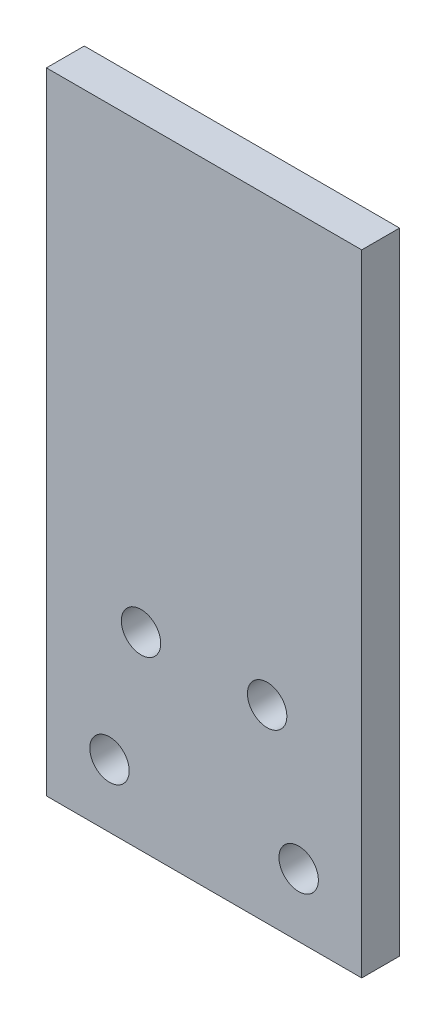
ISO-10303-21;
HEADER;
FILE_DESCRIPTION(('STEP AP214'),'2;1');
FILE_NAME('part.step','',(''),(''),'','','');
FILE_SCHEMA(('AUTOMOTIVE_DESIGN { 1 0 10303 214 1 1 1 1 }'));
ENDSEC;
DATA;
#1=APPLICATION_CONTEXT('core data for automotive mechanical design processes');
#2=APPLICATION_PROTOCOL_DEFINITION('international standard','automotive_design',2000,#1);
#3=PRODUCT_CONTEXT('',#1,'mechanical');
#4=PRODUCT('Part','Part','',(#3));
#5=PRODUCT_RELATED_PRODUCT_CATEGORY('part','',(#4));
#6=PRODUCT_DEFINITION_FORMATION('','',#4);
#7=PRODUCT_DEFINITION_CONTEXT('part definition',#1,'design');
#8=PRODUCT_DEFINITION('design','',#6,#7);
#9=PRODUCT_DEFINITION_SHAPE('','',#8);
#10=(LENGTH_UNIT() NAMED_UNIT(*) SI_UNIT(.MILLI.,.METRE.));
#11=(NAMED_UNIT(*) PLANE_ANGLE_UNIT() SI_UNIT($,.RADIAN.));
#12=(NAMED_UNIT(*) SI_UNIT($,.STERADIAN.) SOLID_ANGLE_UNIT());
#13=UNCERTAINTY_MEASURE_WITH_UNIT(LENGTH_MEASURE(1.E-05),#10,'distance_accuracy_value','');
#14=(GEOMETRIC_REPRESENTATION_CONTEXT(3) GLOBAL_UNCERTAINTY_ASSIGNED_CONTEXT((#13)) GLOBAL_UNIT_ASSIGNED_CONTEXT((#10,
#11,#12)) REPRESENTATION_CONTEXT('',''));
#15=CARTESIAN_POINT('',(0.,0.,0.));
#16=DIRECTION('',(0.,0.,1.));
#17=DIRECTION('',(1.,0.,0.));
#18=AXIS2_PLACEMENT_3D('',#15,#16,#17);
#19=CARTESIAN_POINT('',(-31.75,-63.5,3.81));
#20=DIRECTION('',(0.,1.,0.));
#21=DIRECTION('',(0.,0.,1.));
#22=AXIS2_PLACEMENT_3D('',#19,#20,#21);
#23=PLANE('',#22);
#24=DIRECTION('',(1.,0.,0.));
#25=VECTOR('',#24,1.);
#26=CARTESIAN_POINT('',(-31.75,-63.5,-3.81));
#27=LINE('',#26,#25);
#28=CARTESIAN_POINT('',(-31.75,-63.5,-3.81));
#29=VERTEX_POINT('',#28);
#30=CARTESIAN_POINT('',(31.75,-63.5,-3.81));
#31=VERTEX_POINT('',#30);
#32=EDGE_CURVE('E99',#29,#31,#27,.T.);
#33=ORIENTED_EDGE('',*,*,#32,.T.);
#34=DIRECTION('',(0.,0.,-1.));
#35=VECTOR('',#34,1.);
#36=CARTESIAN_POINT('',(31.75,-63.5,3.81));
#37=LINE('',#36,#35);
#38=CARTESIAN_POINT('',(31.75,-63.5,3.81));
#39=VERTEX_POINT('',#38);
#40=EDGE_CURVE('E11',#39,#31,#37,.T.);
#41=ORIENTED_EDGE('',*,*,#40,.F.);
#42=DIRECTION('',(1.,0.,0.));
#43=VECTOR('',#42,1.);
#44=CARTESIAN_POINT('',(-31.75,-63.5,3.81));
#45=LINE('',#44,#43);
#46=CARTESIAN_POINT('',(-31.75,-63.5,3.81));
#47=VERTEX_POINT('',#46);
#48=EDGE_CURVE('E85',#47,#39,#45,.T.);
#49=ORIENTED_EDGE('',*,*,#48,.F.);
#50=DIRECTION('',(0.,0.,-1.));
#51=VECTOR('',#50,1.);
#52=CARTESIAN_POINT('',(-31.75,-63.5,3.81));
#53=LINE('',#52,#51);
#54=EDGE_CURVE('E52',#47,#29,#53,.T.);
#55=ORIENTED_EDGE('',*,*,#54,.T.);
#56=EDGE_LOOP('',(#33,#41,#49,#55));
#57=FACE_BOUND('',#56,.T.);
#58=ADVANCED_FACE('F36',(#57),#23,.F.);
#59=CARTESIAN_POINT('',(31.75,-63.5,3.81));
#60=DIRECTION('',(-1.,0.,0.));
#61=DIRECTION('',(0.,0.,1.));
#62=AXIS2_PLACEMENT_3D('',#59,#60,#61);
#63=PLANE('',#62);
#64=DIRECTION('',(0.,1.,0.));
#65=VECTOR('',#64,1.);
#66=CARTESIAN_POINT('',(31.75,-63.5,-3.81));
#67=LINE('',#66,#65);
#68=CARTESIAN_POINT('',(31.75,63.5,-3.81));
#69=VERTEX_POINT('',#68);
#70=EDGE_CURVE('E90',#31,#69,#67,.T.);
#71=ORIENTED_EDGE('',*,*,#70,.T.);
#72=DIRECTION('',(0.,0.,-1.));
#73=VECTOR('',#72,1.);
#74=CARTESIAN_POINT('',(31.75,63.5,3.81));
#75=LINE('',#74,#73);
#76=CARTESIAN_POINT('',(31.75,63.5,3.81));
#77=VERTEX_POINT('',#76);
#78=EDGE_CURVE('E44',#77,#69,#75,.T.);
#79=ORIENTED_EDGE('',*,*,#78,.F.);
#80=DIRECTION('',(0.,1.,0.));
#81=VECTOR('',#80,1.);
#82=CARTESIAN_POINT('',(31.75,-63.5,3.81));
#83=LINE('',#82,#81);
#84=EDGE_CURVE('E77',#39,#77,#83,.T.);
#85=ORIENTED_EDGE('',*,*,#84,.F.);
#86=ORIENTED_EDGE('',*,*,#40,.T.);
#87=EDGE_LOOP('',(#71,#79,#85,#86));
#88=FACE_BOUND('',#87,.T.);
#89=ADVANCED_FACE('F89',(#88),#63,.F.);
#90=CARTESIAN_POINT('',(-31.75,63.5,3.81));
#91=DIRECTION('',(0.,1.,0.));
#92=DIRECTION('',(0.,0.,1.));
#93=AXIS2_PLACEMENT_3D('',#90,#91,#92);
#94=PLANE('',#93);
#95=DIRECTION('',(1.,0.,0.));
#96=VECTOR('',#95,1.);
#97=CARTESIAN_POINT('',(-31.75,63.5,-3.81));
#98=LINE('',#97,#96);
#99=CARTESIAN_POINT('',(-31.75,63.5,-3.81));
#100=VERTEX_POINT('',#99);
#101=EDGE_CURVE('E103',#100,#69,#98,.T.);
#102=ORIENTED_EDGE('',*,*,#101,.F.);
#103=DIRECTION('',(0.,0.,-1.));
#104=VECTOR('',#103,1.);
#105=CARTESIAN_POINT('',(-31.75,63.5,3.81));
#106=LINE('',#105,#104);
#107=CARTESIAN_POINT('',(-31.75,63.5,3.81));
#108=VERTEX_POINT('',#107);
#109=EDGE_CURVE('E66',#108,#100,#106,.T.);
#110=ORIENTED_EDGE('',*,*,#109,.F.);
#111=DIRECTION('',(1.,0.,0.));
#112=VECTOR('',#111,1.);
#113=CARTESIAN_POINT('',(-31.75,63.5,3.81));
#114=LINE('',#113,#112);
#115=EDGE_CURVE('E84',#108,#77,#114,.T.);
#116=ORIENTED_EDGE('',*,*,#115,.T.);
#117=ORIENTED_EDGE('',*,*,#78,.T.);
#118=EDGE_LOOP('',(#102,#110,#116,#117));
#119=FACE_BOUND('',#118,.T.);
#120=ADVANCED_FACE('F93',(#119),#94,.T.);
#121=CARTESIAN_POINT('',(-31.75,-63.5,3.81));
#122=DIRECTION('',(-1.,0.,0.));
#123=DIRECTION('',(0.,0.,1.));
#124=AXIS2_PLACEMENT_3D('',#121,#122,#123);
#125=PLANE('',#124);
#126=DIRECTION('',(0.,1.,0.));
#127=VECTOR('',#126,1.);
#128=CARTESIAN_POINT('',(-31.75,-63.5,-3.81));
#129=LINE('',#128,#127);
#130=EDGE_CURVE('E105',#29,#100,#129,.T.);
#131=ORIENTED_EDGE('',*,*,#130,.F.);
#132=ORIENTED_EDGE('',*,*,#54,.F.);
#133=DIRECTION('',(0.,1.,0.));
#134=VECTOR('',#133,1.);
#135=CARTESIAN_POINT('',(-31.75,-63.5,3.81));
#136=LINE('',#135,#134);
#137=EDGE_CURVE('E94',#47,#108,#136,.T.);
#138=ORIENTED_EDGE('',*,*,#137,.T.);
#139=ORIENTED_EDGE('',*,*,#109,.T.);
#140=EDGE_LOOP('',(#131,#132,#138,#139));
#141=FACE_BOUND('',#140,.T.);
#142=ADVANCED_FACE('F140',(#141),#125,.T.);
#143=CARTESIAN_POINT('',(0.,0.,3.81));
#144=DIRECTION('',(0.,0.,1.));
#145=DIRECTION('',(1.,0.,0.));
#146=AXIS2_PLACEMENT_3D('',#143,#144,#145);
#147=PLANE('',#146);
#148=CARTESIAN_POINT('',(-12.7,-25.4,3.81));
#149=DIRECTION('',(0.,0.,1.));
#150=DIRECTION('',(1.,0.,0.));
#151=AXIS2_PLACEMENT_3D('',#148,#149,#150);
#152=CIRCLE('',#151,3.96874999999999);
#153=CARTESIAN_POINT('',(-8.73125000000001,-25.4,3.81));
#154=VERTEX_POINT('',#153);
#155=EDGE_CURVE('E131',#154,#154,#152,.T.);
#156=ORIENTED_EDGE('',*,*,#155,.F.);
#157=EDGE_LOOP('',(#156));
#158=FACE_BOUND('',#157,.T.);
#159=CARTESIAN_POINT('',(12.7,-25.4,3.81));
#160=DIRECTION('',(0.,0.,1.));
#161=DIRECTION('',(1.,0.,0.));
#162=AXIS2_PLACEMENT_3D('',#159,#160,#161);
#163=CIRCLE('',#162,3.96874999999999);
#164=CARTESIAN_POINT('',(16.66875,-25.4,3.81));
#165=VERTEX_POINT('',#164);
#166=EDGE_CURVE('E125',#165,#165,#163,.T.);
#167=ORIENTED_EDGE('',*,*,#166,.F.);
#168=EDGE_LOOP('',(#167));
#169=FACE_BOUND('',#168,.T.);
#170=CARTESIAN_POINT('',(-19.05,-50.8,3.81));
#171=DIRECTION('',(0.,0.,1.));
#172=DIRECTION('',(1.,0.,0.));
#173=AXIS2_PLACEMENT_3D('',#170,#171,#172);
#174=CIRCLE('',#173,3.96874999999999);
#175=CARTESIAN_POINT('',(-15.08125,-50.8,3.81));
#176=VERTEX_POINT('',#175);
#177=EDGE_CURVE('E119',#176,#176,#174,.T.);
#178=ORIENTED_EDGE('',*,*,#177,.F.);
#179=EDGE_LOOP('',(#178));
#180=FACE_BOUND('',#179,.T.);
#181=CARTESIAN_POINT('',(19.05,-50.8,3.81));
#182=DIRECTION('',(0.,0.,1.));
#183=DIRECTION('',(1.,0.,0.));
#184=AXIS2_PLACEMENT_3D('',#181,#182,#183);
#185=CIRCLE('',#184,3.96874999999999);
#186=CARTESIAN_POINT('',(23.01875,-50.8,3.81));
#187=VERTEX_POINT('',#186);
#188=EDGE_CURVE('E113',#187,#187,#185,.T.);
#189=ORIENTED_EDGE('',*,*,#188,.F.);
#190=EDGE_LOOP('',(#189));
#191=FACE_BOUND('',#190,.T.);
#192=ORIENTED_EDGE('',*,*,#48,.T.);
#193=ORIENTED_EDGE('',*,*,#84,.T.);
#194=ORIENTED_EDGE('',*,*,#115,.F.);
#195=ORIENTED_EDGE('',*,*,#137,.F.);
#196=EDGE_LOOP('',(#192,#193,#194,#195));
#197=FACE_BOUND('',#196,.T.);
#198=ADVANCED_FACE('F81',(#158,#169,#180,#191,#197),#147,.T.);
#199=CARTESIAN_POINT('',(0.,0.,-3.81));
#200=DIRECTION('',(0.,0.,1.));
#201=DIRECTION('',(1.,0.,0.));
#202=AXIS2_PLACEMENT_3D('',#199,#200,#201);
#203=PLANE('',#202);
#204=CARTESIAN_POINT('',(-12.7,-25.4,-3.81));
#205=DIRECTION('',(0.,0.,1.));
#206=DIRECTION('',(1.,0.,0.));
#207=AXIS2_PLACEMENT_3D('',#204,#205,#206);
#208=CIRCLE('',#207,3.96875);
#209=CARTESIAN_POINT('',(-8.73125,-25.4,-3.81));
#210=VERTEX_POINT('',#209);
#211=EDGE_CURVE('E128',#210,#210,#208,.T.);
#212=ORIENTED_EDGE('',*,*,#211,.T.);
#213=EDGE_LOOP('',(#212));
#214=FACE_BOUND('',#213,.T.);
#215=CARTESIAN_POINT('',(12.7,-25.4,-3.81));
#216=DIRECTION('',(0.,0.,1.));
#217=DIRECTION('',(1.,0.,0.));
#218=AXIS2_PLACEMENT_3D('',#215,#216,#217);
#219=CIRCLE('',#218,3.96875);
#220=CARTESIAN_POINT('',(16.66875,-25.4,-3.81));
#221=VERTEX_POINT('',#220);
#222=EDGE_CURVE('E122',#221,#221,#219,.T.);
#223=ORIENTED_EDGE('',*,*,#222,.T.);
#224=EDGE_LOOP('',(#223));
#225=FACE_BOUND('',#224,.T.);
#226=CARTESIAN_POINT('',(-19.05,-50.8,-3.81));
#227=DIRECTION('',(0.,0.,1.));
#228=DIRECTION('',(1.,0.,0.));
#229=AXIS2_PLACEMENT_3D('',#226,#227,#228);
#230=CIRCLE('',#229,3.96875);
#231=CARTESIAN_POINT('',(-15.08125,-50.8,-3.81));
#232=VERTEX_POINT('',#231);
#233=EDGE_CURVE('E116',#232,#232,#230,.T.);
#234=ORIENTED_EDGE('',*,*,#233,.T.);
#235=EDGE_LOOP('',(#234));
#236=FACE_BOUND('',#235,.T.);
#237=CARTESIAN_POINT('',(19.05,-50.8,-3.81));
#238=DIRECTION('',(0.,0.,1.));
#239=DIRECTION('',(1.,0.,0.));
#240=AXIS2_PLACEMENT_3D('',#237,#238,#239);
#241=CIRCLE('',#240,3.96875);
#242=CARTESIAN_POINT('',(23.01875,-50.8,-3.81));
#243=VERTEX_POINT('',#242);
#244=EDGE_CURVE('E101',#243,#243,#241,.T.);
#245=ORIENTED_EDGE('',*,*,#244,.T.);
#246=EDGE_LOOP('',(#245));
#247=FACE_BOUND('',#246,.T.);
#248=ORIENTED_EDGE('',*,*,#32,.F.);
#249=ORIENTED_EDGE('',*,*,#130,.T.);
#250=ORIENTED_EDGE('',*,*,#101,.T.);
#251=ORIENTED_EDGE('',*,*,#70,.F.);
#252=EDGE_LOOP('',(#248,#249,#250,#251));
#253=FACE_BOUND('',#252,.T.);
#254=ADVANCED_FACE('F139',(#214,#225,#236,#247,#253),#203,.F.);
#255=CARTESIAN_POINT('',(19.05,-50.8,3.81));
#256=DIRECTION('',(0.,0.,1.));
#257=DIRECTION('',(1.,0.,0.));
#258=AXIS2_PLACEMENT_3D('',#255,#256,#257);
#259=CYLINDRICAL_SURFACE('',#258,3.96874999999999);
#260=ORIENTED_EDGE('',*,*,#244,.F.);
#261=EDGE_LOOP('',(#260));
#262=FACE_BOUND('',#261,.T.);
#263=ORIENTED_EDGE('',*,*,#188,.T.);
#264=EDGE_LOOP('',(#263));
#265=FACE_BOUND('',#264,.T.);
#266=ADVANCED_FACE('F148',(#262,#265),#259,.F.);
#267=CARTESIAN_POINT('',(-19.05,-50.8,3.81));
#268=DIRECTION('',(0.,0.,1.));
#269=DIRECTION('',(1.,0.,0.));
#270=AXIS2_PLACEMENT_3D('',#267,#268,#269);
#271=CYLINDRICAL_SURFACE('',#270,3.96874999999999);
#272=ORIENTED_EDGE('',*,*,#233,.F.);
#273=EDGE_LOOP('',(#272));
#274=FACE_BOUND('',#273,.T.);
#275=ORIENTED_EDGE('',*,*,#177,.T.);
#276=EDGE_LOOP('',(#275));
#277=FACE_BOUND('',#276,.T.);
#278=ADVANCED_FACE('F150',(#274,#277),#271,.F.);
#279=CARTESIAN_POINT('',(12.7,-25.4,3.81));
#280=DIRECTION('',(0.,0.,1.));
#281=DIRECTION('',(1.,0.,0.));
#282=AXIS2_PLACEMENT_3D('',#279,#280,#281);
#283=CYLINDRICAL_SURFACE('',#282,3.96874999999999);
#284=ORIENTED_EDGE('',*,*,#222,.F.);
#285=EDGE_LOOP('',(#284));
#286=FACE_BOUND('',#285,.T.);
#287=ORIENTED_EDGE('',*,*,#166,.T.);
#288=EDGE_LOOP('',(#287));
#289=FACE_BOUND('',#288,.T.);
#290=ADVANCED_FACE('F157',(#286,#289),#283,.F.);
#291=CARTESIAN_POINT('',(-12.7,-25.4,3.81));
#292=DIRECTION('',(0.,0.,1.));
#293=DIRECTION('',(1.,0.,0.));
#294=AXIS2_PLACEMENT_3D('',#291,#292,#293);
#295=CYLINDRICAL_SURFACE('',#294,3.96874999999999);
#296=ORIENTED_EDGE('',*,*,#211,.F.);
#297=EDGE_LOOP('',(#296));
#298=FACE_BOUND('',#297,.T.);
#299=ORIENTED_EDGE('',*,*,#155,.T.);
#300=EDGE_LOOP('',(#299));
#301=FACE_BOUND('',#300,.T.);
#302=ADVANCED_FACE('F135',(#298,#301),#295,.F.);
#303=CLOSED_SHELL('',(#58,#89,#120,#142,#198,#254,#266,#278,#290,#302));
#304=MANIFOLD_SOLID_BREP('B2',#303);
#305=ADVANCED_BREP_SHAPE_REPRESENTATION('',(#18,#304),#14);
#306=SHAPE_DEFINITION_REPRESENTATION(#9,#305);
ENDSEC;
END-ISO-10303-21;
